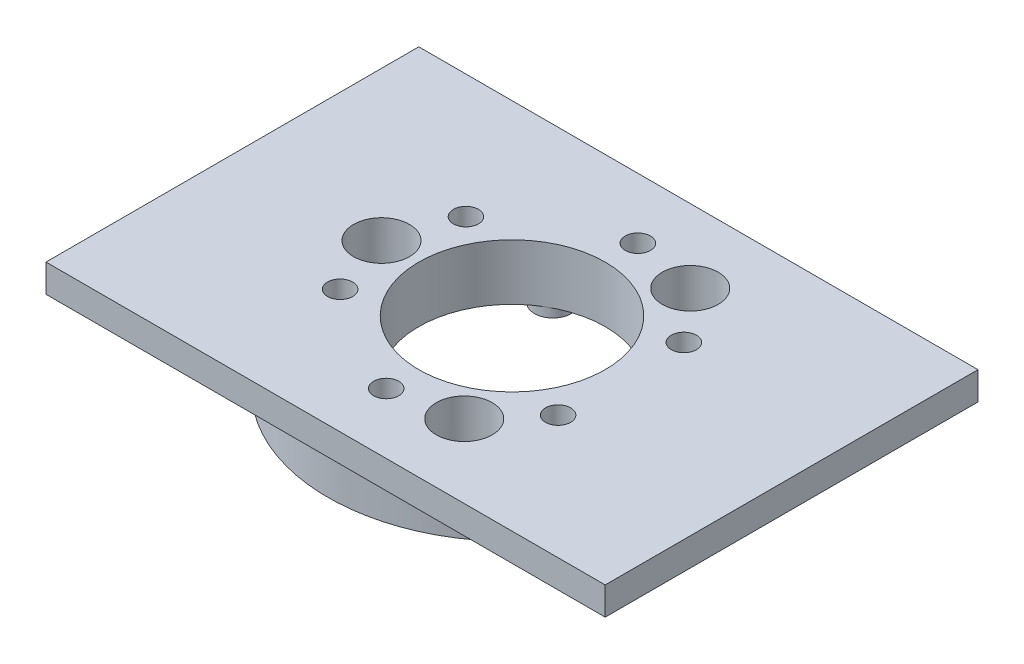
ISO-10303-21;
HEADER;
FILE_DESCRIPTION(('STEP AP214'),'2;1');
FILE_NAME('part.step','',(''),(''),'','','');
FILE_SCHEMA(('AUTOMOTIVE_DESIGN { 1 0 10303 214 1 1 1 1 }'));
ENDSEC;
DATA;
#1=APPLICATION_CONTEXT('core data for automotive mechanical design processes');
#2=APPLICATION_PROTOCOL_DEFINITION('international standard','automotive_design',2000,#1);
#3=PRODUCT_CONTEXT('',#1,'mechanical');
#4=PRODUCT('Part','Part','',(#3));
#5=PRODUCT_RELATED_PRODUCT_CATEGORY('part','',(#4));
#6=PRODUCT_DEFINITION_FORMATION('','',#4);
#7=PRODUCT_DEFINITION_CONTEXT('part definition',#1,'design');
#8=PRODUCT_DEFINITION('design','',#6,#7);
#9=PRODUCT_DEFINITION_SHAPE('','',#8);
#10=(LENGTH_UNIT() NAMED_UNIT(*) SI_UNIT(.MILLI.,.METRE.));
#11=(NAMED_UNIT(*) PLANE_ANGLE_UNIT() SI_UNIT($,.RADIAN.));
#12=(NAMED_UNIT(*) SI_UNIT($,.STERADIAN.) SOLID_ANGLE_UNIT());
#13=UNCERTAINTY_MEASURE_WITH_UNIT(LENGTH_MEASURE(1.E-05),#10,'distance_accuracy_value','');
#14=(GEOMETRIC_REPRESENTATION_CONTEXT(3) GLOBAL_UNCERTAINTY_ASSIGNED_CONTEXT((#13)) GLOBAL_UNIT_ASSIGNED_CONTEXT((#10,
#11,#12)) REPRESENTATION_CONTEXT('',''));
#15=CARTESIAN_POINT('',(0.,0.,0.));
#16=DIRECTION('',(0.,0.,1.));
#17=DIRECTION('',(1.,0.,0.));
#18=AXIS2_PLACEMENT_3D('',#15,#16,#17);
#19=CARTESIAN_POINT('',(0.,1.,0.));
#20=DIRECTION('',(0.,1.,0.));
#21=DIRECTION('',(0.,0.,1.));
#22=AXIS2_PLACEMENT_3D('',#19,#20,#21);
#23=PLANE('',#22);
#24=CARTESIAN_POINT('',(-14.,1.,0.));
#25=DIRECTION('',(0.,-1.,0.));
#26=DIRECTION('',(0.,0.,-1.));
#27=AXIS2_PLACEMENT_3D('',#24,#25,#26);
#28=CIRCLE('',#27,3.);
#29=CARTESIAN_POINT('',(-14.,1.,-3.));
#30=VERTEX_POINT('',#29);
#31=EDGE_CURVE('E139',#30,#30,#28,.T.);
#32=ORIENTED_EDGE('',*,*,#31,.F.);
#33=EDGE_LOOP('',(#32));
#34=FACE_BOUND('',#33,.T.);
#35=CARTESIAN_POINT('',(7.,1.,12.1243556529821));
#36=DIRECTION('',(0.,-1.,0.));
#37=DIRECTION('',(0.,0.,-1.));
#38=AXIS2_PLACEMENT_3D('',#35,#36,#37);
#39=CIRCLE('',#38,3.);
#40=CARTESIAN_POINT('',(7.,1.,9.12435565298214));
#41=VERTEX_POINT('',#40);
#42=EDGE_CURVE('E145',#41,#41,#39,.T.);
#43=ORIENTED_EDGE('',*,*,#42,.F.);
#44=EDGE_LOOP('',(#43));
#45=FACE_BOUND('',#44,.T.);
#46=CARTESIAN_POINT('',(7.,1.,-12.1243556529821));
#47=DIRECTION('',(0.,-1.,0.));
#48=DIRECTION('',(0.,0.,-1.));
#49=AXIS2_PLACEMENT_3D('',#46,#47,#48);
#50=CIRCLE('',#49,2.99999999999999);
#51=CARTESIAN_POINT('',(7.,1.,-15.1243556529821));
#52=VERTEX_POINT('',#51);
#53=EDGE_CURVE('E137',#52,#52,#50,.T.);
#54=ORIENTED_EDGE('',*,*,#53,.F.);
#55=EDGE_LOOP('',(#54));
#56=FACE_BOUND('',#55,.T.);
#57=CARTESIAN_POINT('',(12.,1.,0.));
#58=DIRECTION('',(0.,1.,0.));
#59=DIRECTION('',(0.,0.,1.));
#60=AXIS2_PLACEMENT_3D('',#57,#58,#59);
#61=CIRCLE('',#60,1.98);
#62=CARTESIAN_POINT('',(12.,1.,1.98));
#63=VERTEX_POINT('',#62);
#64=EDGE_CURVE('E250',#63,#63,#61,.F.);
#65=ORIENTED_EDGE('',*,*,#64,.F.);
#66=EDGE_LOOP('',(#65));
#67=FACE_BOUND('',#66,.T.);
#68=CARTESIAN_POINT('',(-6.,1.,-10.3923048454133));
#69=DIRECTION('',(0.,1.,0.));
#70=DIRECTION('',(0.,0.,1.));
#71=AXIS2_PLACEMENT_3D('',#68,#69,#70);
#72=CIRCLE('',#71,1.98);
#73=CARTESIAN_POINT('',(-6.,1.,-8.41230484541327));
#74=VERTEX_POINT('',#73);
#75=EDGE_CURVE('E244',#74,#74,#72,.F.);
#76=ORIENTED_EDGE('',*,*,#75,.F.);
#77=EDGE_LOOP('',(#76));
#78=FACE_BOUND('',#77,.T.);
#79=CARTESIAN_POINT('',(-6.,1.,10.3923048454133));
#80=DIRECTION('',(0.,1.,0.));
#81=DIRECTION('',(0.,0.,1.));
#82=AXIS2_PLACEMENT_3D('',#79,#80,#81);
#83=CIRCLE('',#82,1.98);
#84=CARTESIAN_POINT('',(-6.,1.,12.3723048454133));
#85=VERTEX_POINT('',#84);
#86=EDGE_CURVE('E245',#85,#85,#83,.F.);
#87=ORIENTED_EDGE('',*,*,#86,.F.);
#88=EDGE_LOOP('',(#87));
#89=FACE_BOUND('',#88,.T.);
#90=CARTESIAN_POINT('',(0.,1.,13.5));
#91=DIRECTION('',(0.,-1.,0.));
#92=DIRECTION('',(0.,0.,-1.));
#93=AXIS2_PLACEMENT_3D('',#90,#91,#92);
#94=CIRCLE('',#93,1.35);
#95=CARTESIAN_POINT('',(0.,1.,12.15));
#96=VERTEX_POINT('',#95);
#97=EDGE_CURVE('E200',#96,#96,#94,.T.);
#98=ORIENTED_EDGE('',*,*,#97,.F.);
#99=EDGE_LOOP('',(#98));
#100=FACE_BOUND('',#99,.T.);
#101=CARTESIAN_POINT('',(0.,1.,-13.5));
#102=DIRECTION('',(0.,-1.,0.));
#103=DIRECTION('',(0.,0.,-1.));
#104=AXIS2_PLACEMENT_3D('',#101,#102,#103);
#105=CIRCLE('',#104,1.35);
#106=CARTESIAN_POINT('',(0.,1.,-14.85));
#107=VERTEX_POINT('',#106);
#108=EDGE_CURVE('E209',#107,#107,#105,.T.);
#109=ORIENTED_EDGE('',*,*,#108,.F.);
#110=EDGE_LOOP('',(#109));
#111=FACE_BOUND('',#110,.T.);
#112=CARTESIAN_POINT('',(11.6913429510899,1.,-6.75));
#113=DIRECTION('',(0.,-1.,0.));
#114=DIRECTION('',(0.,0.,-1.));
#115=AXIS2_PLACEMENT_3D('',#112,#113,#114);
#116=CIRCLE('',#115,1.35);
#117=CARTESIAN_POINT('',(11.6913429510899,1.,-8.1));
#118=VERTEX_POINT('',#117);
#119=EDGE_CURVE('E201',#118,#118,#116,.T.);
#120=ORIENTED_EDGE('',*,*,#119,.F.);
#121=EDGE_LOOP('',(#120));
#122=FACE_BOUND('',#121,.T.);
#123=CARTESIAN_POINT('',(11.6913429510899,1.,6.75));
#124=DIRECTION('',(0.,-1.,0.));
#125=DIRECTION('',(0.,0.,-1.));
#126=AXIS2_PLACEMENT_3D('',#123,#124,#125);
#127=CIRCLE('',#126,1.35);
#128=CARTESIAN_POINT('',(11.6913429510899,1.,5.4));
#129=VERTEX_POINT('',#128);
#130=EDGE_CURVE('E219',#129,#129,#127,.T.);
#131=ORIENTED_EDGE('',*,*,#130,.F.);
#132=EDGE_LOOP('',(#131));
#133=FACE_BOUND('',#132,.T.);
#134=CARTESIAN_POINT('',(-11.6913429510899,1.,-6.75000000000001));
#135=DIRECTION('',(0.,-1.,0.));
#136=DIRECTION('',(0.,0.,-1.));
#137=AXIS2_PLACEMENT_3D('',#134,#135,#136);
#138=CIRCLE('',#137,1.35);
#139=CARTESIAN_POINT('',(-11.6913429510899,1.,-8.10000000000001));
#140=VERTEX_POINT('',#139);
#141=EDGE_CURVE('E211',#140,#140,#138,.T.);
#142=ORIENTED_EDGE('',*,*,#141,.F.);
#143=EDGE_LOOP('',(#142));
#144=FACE_BOUND('',#143,.T.);
#145=CARTESIAN_POINT('',(-11.6913429510899,1.,6.75));
#146=DIRECTION('',(0.,-1.,0.));
#147=DIRECTION('',(0.,0.,-1.));
#148=AXIS2_PLACEMENT_3D('',#145,#146,#147);
#149=CIRCLE('',#148,1.35);
#150=CARTESIAN_POINT('',(-11.6913429510899,1.,5.4));
#151=VERTEX_POINT('',#150);
#152=EDGE_CURVE('E229',#151,#151,#149,.T.);
#153=ORIENTED_EDGE('',*,*,#152,.F.);
#154=EDGE_LOOP('',(#153));
#155=FACE_BOUND('',#154,.T.);
#156=CARTESIAN_POINT('',(0.,1.,0.));
#157=DIRECTION('',(0.,1.,0.));
#158=DIRECTION('',(0.,0.,1.));
#159=AXIS2_PLACEMENT_3D('',#156,#157,#158);
#160=CIRCLE('',#159,18.77);
#161=CARTESIAN_POINT('',(0.,1.,18.77));
#162=VERTEX_POINT('',#161);
#163=EDGE_CURVE('E196',#162,#162,#160,.T.);
#164=ORIENTED_EDGE('',*,*,#163,.F.);
#165=EDGE_LOOP('',(#164));
#166=FACE_BOUND('',#165,.T.);
#167=CARTESIAN_POINT('',(0.,1.,0.));
#168=DIRECTION('',(0.,-1.,0.));
#169=DIRECTION('',(0.,0.,-1.));
#170=AXIS2_PLACEMENT_3D('',#167,#168,#169);
#171=CIRCLE('',#170,10.);
#172=CARTESIAN_POINT('',(0.,1.,-10.));
#173=VERTEX_POINT('',#172);
#174=EDGE_CURVE('E199',#173,#173,#171,.T.);
#175=ORIENTED_EDGE('',*,*,#174,.F.);
#176=EDGE_LOOP('',(#175));
#177=FACE_BOUND('',#176,.T.);
#178=ADVANCED_FACE('F43',(#34,#45,#56,#67,#78,#89,#100,#111,#122,#133,#144,#155,#166,#177),#23,.F.);
#179=CARTESIAN_POINT('',(0.,0.,0.));
#180=DIRECTION('',(0.,1.,0.));
#181=DIRECTION('',(0.,0.,1.));
#182=AXIS2_PLACEMENT_3D('',#179,#180,#181);
#183=PLANE('',#182);
#184=CARTESIAN_POINT('',(0.,0.,0.));
#185=DIRECTION('',(0.,1.,0.));
#186=DIRECTION('',(0.,0.,1.));
#187=AXIS2_PLACEMENT_3D('',#184,#185,#186);
#188=CIRCLE('',#187,19.75);
#189=CARTESIAN_POINT('',(-5.63424270988335,0.,-18.9292844314339));
#190=VERTEX_POINT('',#189);
#191=CARTESIAN_POINT('',(5.63424270988335,0.,-18.9292844314339));
#192=VERTEX_POINT('',#191);
#193=EDGE_CURVE('E238',#190,#192,#188,.T.);
#194=ORIENTED_EDGE('',*,*,#193,.F.);
#195=DIRECTION('',(0.285278111892828,0.,0.958444781338426));
#196=VECTOR('',#195,1.);
#197=CARTESIAN_POINT('',(-5.51890637124537,0.,-18.5417905885562));
#198=LINE('',#197,#196);
#199=CARTESIAN_POINT('',(-5.99084034974938,0.,-20.1273404081069));
#200=VERTEX_POINT('',#199);
#201=EDGE_CURVE('E111',#200,#190,#198,.T.);
#202=ORIENTED_EDGE('',*,*,#201,.F.);
#203=CARTESIAN_POINT('',(0.,0.,0.));
#204=DIRECTION('',(0.,1.,0.));
#205=DIRECTION('',(0.,0.,1.));
#206=AXIS2_PLACEMENT_3D('',#203,#204,#205);
#207=CIRCLE('',#206,21.);
#208=CARTESIAN_POINT('',(5.99084034974938,0.,-20.1273404081069));
#209=VERTEX_POINT('',#208);
#210=EDGE_CURVE('E115',#209,#200,#207,.T.);
#211=ORIENTED_EDGE('',*,*,#210,.F.);
#212=DIRECTION('',(0.285278111892828,0.,-0.958444781338426));
#213=VECTOR('',#212,1.);
#214=CARTESIAN_POINT('',(5.51890637124537,0.,-18.5417905885562));
#215=LINE('',#214,#213);
#216=EDGE_CURVE('E102',#192,#209,#215,.T.);
#217=ORIENTED_EDGE('',*,*,#216,.F.);
#218=EDGE_LOOP('',(#194,#202,#211,#217));
#219=FACE_BOUND('',#218,.T.);
#220=CARTESIAN_POINT('',(0.,0.,0.));
#221=DIRECTION('',(0.,1.,0.));
#222=DIRECTION('',(0.,0.,1.));
#223=AXIS2_PLACEMENT_3D('',#220,#221,#222);
#224=CIRCLE('',#223,18.77);
#225=CARTESIAN_POINT('',(0.,0.,18.77));
#226=VERTEX_POINT('',#225);
#227=EDGE_CURVE('E240',#226,#226,#224,.T.);
#228=ORIENTED_EDGE('',*,*,#227,.T.);
#229=EDGE_LOOP('',(#228));
#230=FACE_BOUND('',#229,.T.);
#231=ADVANCED_FACE('F126',(#219,#230),#183,.F.);
#232=CARTESIAN_POINT('',(0.,1.,0.));
#233=DIRECTION('',(0.,-1.,0.));
#234=DIRECTION('',(0.,0.,-1.));
#235=AXIS2_PLACEMENT_3D('',#232,#233,#234);
#236=CYLINDRICAL_SURFACE('',#235,19.75);
#237=CARTESIAN_POINT('',(0.,4.,0.));
#238=DIRECTION('',(0.,1.,0.));
#239=DIRECTION('',(0.,0.,1.));
#240=AXIS2_PLACEMENT_3D('',#237,#238,#239);
#241=CIRCLE('',#240,19.75);
#242=CARTESIAN_POINT('',(0.,4.,19.75));
#243=VERTEX_POINT('',#242);
#244=EDGE_CURVE('E149',#243,#243,#241,.T.);
#245=ORIENTED_EDGE('',*,*,#244,.F.);
#246=EDGE_LOOP('',(#245));
#247=FACE_BOUND('',#246,.T.);
#248=CARTESIAN_POINT('',(0.,3.,0.));
#249=DIRECTION('',(0.,-1.,0.));
#250=DIRECTION('',(0.,0.,-1.));
#251=AXIS2_PLACEMENT_3D('',#248,#249,#250);
#252=CIRCLE('',#251,19.75);
#253=CARTESIAN_POINT('',(-5.63424270988335,3.,-18.9292844314339));
#254=VERTEX_POINT('',#253);
#255=CARTESIAN_POINT('',(5.63424270988335,3.,-18.9292844314339));
#256=VERTEX_POINT('',#255);
#257=EDGE_CURVE('E60',#254,#256,#252,.T.);
#258=ORIENTED_EDGE('',*,*,#257,.F.);
#259=DIRECTION('',(0.,-1.,0.));
#260=VECTOR('',#259,1.);
#261=CARTESIAN_POINT('',(-5.63424270988335,1.,-18.9292844314339));
#262=LINE('',#261,#260);
#263=EDGE_CURVE('E11',#254,#190,#262,.T.);
#264=ORIENTED_EDGE('',*,*,#263,.T.);
#265=ORIENTED_EDGE('',*,*,#193,.T.);
#266=DIRECTION('',(0.,-1.,0.));
#267=VECTOR('',#266,1.);
#268=CARTESIAN_POINT('',(5.63424270988335,1.,-18.9292844314339));
#269=LINE('',#268,#267);
#270=EDGE_CURVE('E51',#192,#256,#269,.F.);
#271=ORIENTED_EDGE('',*,*,#270,.T.);
#272=EDGE_LOOP('',(#258,#264,#265,#271));
#273=FACE_BOUND('',#272,.T.);
#274=ADVANCED_FACE('F44',(#247,#273),#236,.T.);
#275=CARTESIAN_POINT('',(0.,1.,0.));
#276=DIRECTION('',(0.,-1.,0.));
#277=DIRECTION('',(0.,0.,-1.));
#278=AXIS2_PLACEMENT_3D('',#275,#276,#277);
#279=CYLINDRICAL_SURFACE('',#278,18.77);
#280=ORIENTED_EDGE('',*,*,#163,.T.);
#281=EDGE_LOOP('',(#280));
#282=FACE_BOUND('',#281,.T.);
#283=ORIENTED_EDGE('',*,*,#227,.F.);
#284=EDGE_LOOP('',(#283));
#285=FACE_BOUND('',#284,.T.);
#286=ADVANCED_FACE('F288',(#282,#285),#279,.F.);
#287=CARTESIAN_POINT('',(0.,7.,0.));
#288=DIRECTION('',(0.,1.,0.));
#289=DIRECTION('',(0.,0.,1.));
#290=AXIS2_PLACEMENT_3D('',#287,#288,#289);
#291=PLANE('',#290);
#292=CARTESIAN_POINT('',(-14.,7.,0.));
#293=DIRECTION('',(0.,1.,0.));
#294=DIRECTION('',(0.,0.,1.));
#295=AXIS2_PLACEMENT_3D('',#292,#293,#294);
#296=CIRCLE('',#295,3.);
#297=CARTESIAN_POINT('',(-14.,7.,3.));
#298=VERTEX_POINT('',#297);
#299=EDGE_CURVE('E153',#298,#298,#296,.T.);
#300=ORIENTED_EDGE('',*,*,#299,.F.);
#301=EDGE_LOOP('',(#300));
#302=FACE_BOUND('',#301,.T.);
#303=CARTESIAN_POINT('',(7.,7.,12.1243556529821));
#304=DIRECTION('',(0.,1.,0.));
#305=DIRECTION('',(0.,0.,1.));
#306=AXIS2_PLACEMENT_3D('',#303,#304,#305);
#307=CIRCLE('',#306,3.);
#308=CARTESIAN_POINT('',(7.,7.,15.1243556529821));
#309=VERTEX_POINT('',#308);
#310=EDGE_CURVE('E251',#309,#309,#307,.T.);
#311=ORIENTED_EDGE('',*,*,#310,.F.);
#312=EDGE_LOOP('',(#311));
#313=FACE_BOUND('',#312,.T.);
#314=CARTESIAN_POINT('',(7.,7.,-12.1243556529821));
#315=DIRECTION('',(0.,1.,0.));
#316=DIRECTION('',(0.,0.,1.));
#317=AXIS2_PLACEMENT_3D('',#314,#315,#316);
#318=CIRCLE('',#317,2.99999999999999);
#319=CARTESIAN_POINT('',(7.,7.,-9.12435565298215));
#320=VERTEX_POINT('',#319);
#321=EDGE_CURVE('E141',#320,#320,#318,.T.);
#322=ORIENTED_EDGE('',*,*,#321,.F.);
#323=EDGE_LOOP('',(#322));
#324=FACE_BOUND('',#323,.T.);
#325=CARTESIAN_POINT('',(0.,7.,13.5));
#326=DIRECTION('',(0.,-1.,0.));
#327=DIRECTION('',(0.,0.,-1.));
#328=AXIS2_PLACEMENT_3D('',#325,#326,#327);
#329=CIRCLE('',#328,1.35);
#330=CARTESIAN_POINT('',(0.,7.,12.15));
#331=VERTEX_POINT('',#330);
#332=EDGE_CURVE('E193',#331,#331,#329,.T.);
#333=ORIENTED_EDGE('',*,*,#332,.T.);
#334=EDGE_LOOP('',(#333));
#335=FACE_BOUND('',#334,.T.);
#336=CARTESIAN_POINT('',(0.,7.,-13.5));
#337=DIRECTION('',(0.,-1.,0.));
#338=DIRECTION('',(0.,0.,-1.));
#339=AXIS2_PLACEMENT_3D('',#336,#337,#338);
#340=CIRCLE('',#339,1.35);
#341=CARTESIAN_POINT('',(0.,7.,-14.85));
#342=VERTEX_POINT('',#341);
#343=EDGE_CURVE('E212',#342,#342,#340,.T.);
#344=ORIENTED_EDGE('',*,*,#343,.T.);
#345=EDGE_LOOP('',(#344));
#346=FACE_BOUND('',#345,.T.);
#347=CARTESIAN_POINT('',(11.6913429510899,7.,-6.75));
#348=DIRECTION('',(0.,-1.,0.));
#349=DIRECTION('',(0.,0.,-1.));
#350=AXIS2_PLACEMENT_3D('',#347,#348,#349);
#351=CIRCLE('',#350,1.35);
#352=CARTESIAN_POINT('',(11.6913429510899,7.,-8.1));
#353=VERTEX_POINT('',#352);
#354=EDGE_CURVE('E204',#353,#353,#351,.T.);
#355=ORIENTED_EDGE('',*,*,#354,.T.);
#356=EDGE_LOOP('',(#355));
#357=FACE_BOUND('',#356,.T.);
#358=CARTESIAN_POINT('',(11.6913429510899,7.,6.75));
#359=DIRECTION('',(0.,-1.,0.));
#360=DIRECTION('',(0.,0.,-1.));
#361=AXIS2_PLACEMENT_3D('',#358,#359,#360);
#362=CIRCLE('',#361,1.35);
#363=CARTESIAN_POINT('',(11.6913429510899,7.,5.4));
#364=VERTEX_POINT('',#363);
#365=EDGE_CURVE('E203',#364,#364,#362,.T.);
#366=ORIENTED_EDGE('',*,*,#365,.T.);
#367=EDGE_LOOP('',(#366));
#368=FACE_BOUND('',#367,.T.);
#369=CARTESIAN_POINT('',(0.,7.,0.));
#370=DIRECTION('',(0.,-1.,0.));
#371=DIRECTION('',(0.,0.,-1.));
#372=AXIS2_PLACEMENT_3D('',#369,#370,#371);
#373=CIRCLE('',#372,10.);
#374=CARTESIAN_POINT('',(0.,7.,-10.));
#375=VERTEX_POINT('',#374);
#376=EDGE_CURVE('E220',#375,#375,#373,.T.);
#377=ORIENTED_EDGE('',*,*,#376,.T.);
#378=EDGE_LOOP('',(#377));
#379=FACE_BOUND('',#378,.T.);
#380=CARTESIAN_POINT('',(-11.6913429510899,7.,-6.75000000000001));
#381=DIRECTION('',(0.,-1.,0.));
#382=DIRECTION('',(0.,0.,-1.));
#383=AXIS2_PLACEMENT_3D('',#380,#381,#382);
#384=CIRCLE('',#383,1.35);
#385=CARTESIAN_POINT('',(-11.6913429510899,7.,-8.10000000000001));
#386=VERTEX_POINT('',#385);
#387=EDGE_CURVE('E230',#386,#386,#384,.T.);
#388=ORIENTED_EDGE('',*,*,#387,.T.);
#389=EDGE_LOOP('',(#388));
#390=FACE_BOUND('',#389,.T.);
#391=CARTESIAN_POINT('',(-11.6913429510899,7.,6.75));
#392=DIRECTION('',(0.,-1.,0.));
#393=DIRECTION('',(0.,0.,-1.));
#394=AXIS2_PLACEMENT_3D('',#391,#392,#393);
#395=CIRCLE('',#394,1.35);
#396=CARTESIAN_POINT('',(-11.6913429510899,7.,5.4));
#397=VERTEX_POINT('',#396);
#398=EDGE_CURVE('E190',#397,#397,#395,.T.);
#399=ORIENTED_EDGE('',*,*,#398,.T.);
#400=EDGE_LOOP('',(#399));
#401=FACE_BOUND('',#400,.T.);
#402=DIRECTION('',(0.,0.,-1.));
#403=VECTOR('',#402,1.);
#404=CARTESIAN_POINT('',(30.,7.,20.));
#405=LINE('',#404,#403);
#406=CARTESIAN_POINT('',(30.,7.,20.));
#407=VERTEX_POINT('',#406);
#408=CARTESIAN_POINT('',(30.,7.,-20.));
#409=VERTEX_POINT('',#408);
#410=EDGE_CURVE('E148',#407,#409,#405,.T.);
#411=ORIENTED_EDGE('',*,*,#410,.T.);
#412=DIRECTION('',(-1.,0.,0.));
#413=VECTOR('',#412,1.);
#414=CARTESIAN_POINT('',(-30.,7.,-20.));
#415=LINE('',#414,#413);
#416=CARTESIAN_POINT('',(-30.,7.,-20.));
#417=VERTEX_POINT('',#416);
#418=EDGE_CURVE('E168',#409,#417,#415,.T.);
#419=ORIENTED_EDGE('',*,*,#418,.T.);
#420=DIRECTION('',(0.,0.,1.));
#421=VECTOR('',#420,1.);
#422=CARTESIAN_POINT('',(-30.,7.,20.));
#423=LINE('',#422,#421);
#424=CARTESIAN_POINT('',(-30.,7.,20.));
#425=VERTEX_POINT('',#424);
#426=EDGE_CURVE('E172',#417,#425,#423,.T.);
#427=ORIENTED_EDGE('',*,*,#426,.T.);
#428=DIRECTION('',(1.,0.,0.));
#429=VECTOR('',#428,1.);
#430=CARTESIAN_POINT('',(-30.,7.,20.));
#431=LINE('',#430,#429);
#432=EDGE_CURVE('E157',#425,#407,#431,.T.);
#433=ORIENTED_EDGE('',*,*,#432,.T.);
#434=EDGE_LOOP('',(#411,#419,#427,#433));
#435=FACE_BOUND('',#434,.T.);
#436=ADVANCED_FACE('F289',(#302,#313,#324,#335,#346,#357,#368,#379,#390,#401,#435),#291,.T.);
#437=CARTESIAN_POINT('',(-11.6913429510899,7.,6.75));
#438=DIRECTION('',(0.,-1.,0.));
#439=DIRECTION('',(0.,0.,-1.));
#440=AXIS2_PLACEMENT_3D('',#437,#438,#439);
#441=CYLINDRICAL_SURFACE('',#440,1.35);
#442=ORIENTED_EDGE('',*,*,#398,.F.);
#443=EDGE_LOOP('',(#442));
#444=FACE_BOUND('',#443,.T.);
#445=ORIENTED_EDGE('',*,*,#152,.T.);
#446=EDGE_LOOP('',(#445));
#447=FACE_BOUND('',#446,.T.);
#448=ADVANCED_FACE('F297',(#444,#447),#441,.F.);
#449=CARTESIAN_POINT('',(-11.6913429510899,7.,-6.75000000000001));
#450=DIRECTION('',(0.,-1.,0.));
#451=DIRECTION('',(0.,0.,-1.));
#452=AXIS2_PLACEMENT_3D('',#449,#450,#451);
#453=CYLINDRICAL_SURFACE('',#452,1.35);
#454=ORIENTED_EDGE('',*,*,#387,.F.);
#455=EDGE_LOOP('',(#454));
#456=FACE_BOUND('',#455,.T.);
#457=ORIENTED_EDGE('',*,*,#141,.T.);
#458=EDGE_LOOP('',(#457));
#459=FACE_BOUND('',#458,.T.);
#460=ADVANCED_FACE('F309',(#456,#459),#453,.F.);
#461=CARTESIAN_POINT('',(0.,7.,0.));
#462=DIRECTION('',(0.,-1.,0.));
#463=DIRECTION('',(0.,0.,-1.));
#464=AXIS2_PLACEMENT_3D('',#461,#462,#463);
#465=CYLINDRICAL_SURFACE('',#464,10.);
#466=ORIENTED_EDGE('',*,*,#376,.F.);
#467=EDGE_LOOP('',(#466));
#468=FACE_BOUND('',#467,.T.);
#469=ORIENTED_EDGE('',*,*,#174,.T.);
#470=EDGE_LOOP('',(#469));
#471=FACE_BOUND('',#470,.T.);
#472=ADVANCED_FACE('F307',(#468,#471),#465,.F.);
#473=CARTESIAN_POINT('',(11.6913429510899,7.,6.75));
#474=DIRECTION('',(0.,-1.,0.));
#475=DIRECTION('',(0.,0.,-1.));
#476=AXIS2_PLACEMENT_3D('',#473,#474,#475);
#477=CYLINDRICAL_SURFACE('',#476,1.35);
#478=ORIENTED_EDGE('',*,*,#365,.F.);
#479=EDGE_LOOP('',(#478));
#480=FACE_BOUND('',#479,.T.);
#481=ORIENTED_EDGE('',*,*,#130,.T.);
#482=EDGE_LOOP('',(#481));
#483=FACE_BOUND('',#482,.T.);
#484=ADVANCED_FACE('F306',(#480,#483),#477,.F.);
#485=CARTESIAN_POINT('',(11.6913429510899,7.,-6.75));
#486=DIRECTION('',(0.,-1.,0.));
#487=DIRECTION('',(0.,0.,-1.));
#488=AXIS2_PLACEMENT_3D('',#485,#486,#487);
#489=CYLINDRICAL_SURFACE('',#488,1.35);
#490=ORIENTED_EDGE('',*,*,#354,.F.);
#491=EDGE_LOOP('',(#490));
#492=FACE_BOUND('',#491,.T.);
#493=ORIENTED_EDGE('',*,*,#119,.T.);
#494=EDGE_LOOP('',(#493));
#495=FACE_BOUND('',#494,.T.);
#496=ADVANCED_FACE('F316',(#492,#495),#489,.F.);
#497=CARTESIAN_POINT('',(0.,7.,-13.5));
#498=DIRECTION('',(0.,-1.,0.));
#499=DIRECTION('',(0.,0.,-1.));
#500=AXIS2_PLACEMENT_3D('',#497,#498,#499);
#501=CYLINDRICAL_SURFACE('',#500,1.35);
#502=ORIENTED_EDGE('',*,*,#343,.F.);
#503=EDGE_LOOP('',(#502));
#504=FACE_BOUND('',#503,.T.);
#505=ORIENTED_EDGE('',*,*,#108,.T.);
#506=EDGE_LOOP('',(#505));
#507=FACE_BOUND('',#506,.T.);
#508=ADVANCED_FACE('F325',(#504,#507),#501,.F.);
#509=CARTESIAN_POINT('',(0.,7.,13.5));
#510=DIRECTION('',(0.,-1.,0.));
#511=DIRECTION('',(0.,0.,-1.));
#512=AXIS2_PLACEMENT_3D('',#509,#510,#511);
#513=CYLINDRICAL_SURFACE('',#512,1.35);
#514=ORIENTED_EDGE('',*,*,#332,.F.);
#515=EDGE_LOOP('',(#514));
#516=FACE_BOUND('',#515,.T.);
#517=ORIENTED_EDGE('',*,*,#97,.T.);
#518=EDGE_LOOP('',(#517));
#519=FACE_BOUND('',#518,.T.);
#520=ADVANCED_FACE('F393',(#516,#519),#513,.F.);
#521=CARTESIAN_POINT('',(-6.,0.,10.3923048454133));
#522=DIRECTION('',(0.,1.,0.));
#523=DIRECTION('',(0.,0.,1.));
#524=AXIS2_PLACEMENT_3D('',#521,#522,#523);
#525=CYLINDRICAL_SURFACE('',#524,1.98);
#526=CARTESIAN_POINT('',(-6.,0.,10.3923048454133));
#527=DIRECTION('',(0.,-1.,0.));
#528=DIRECTION('',(0.,0.,-1.));
#529=AXIS2_PLACEMENT_3D('',#526,#527,#528);
#530=CIRCLE('',#529,1.98);
#531=CARTESIAN_POINT('',(-6.,0.,8.41230484541327));
#532=VERTEX_POINT('',#531);
#533=EDGE_CURVE('E176',#532,#532,#530,.T.);
#534=ORIENTED_EDGE('',*,*,#533,.F.);
#535=EDGE_LOOP('',(#534));
#536=FACE_BOUND('',#535,.T.);
#537=ORIENTED_EDGE('',*,*,#86,.T.);
#538=EDGE_LOOP('',(#537));
#539=FACE_BOUND('',#538,.T.);
#540=ADVANCED_FACE('F386',(#536,#539),#525,.T.);
#541=CARTESIAN_POINT('',(-6.,0.,10.3923048454133));
#542=DIRECTION('',(0.,-1.,0.));
#543=DIRECTION('',(0.,0.,-1.));
#544=AXIS2_PLACEMENT_3D('',#541,#542,#543);
#545=PLANE('',#544);
#546=ORIENTED_EDGE('',*,*,#533,.T.);
#547=EDGE_LOOP('',(#546));
#548=FACE_BOUND('',#547,.T.);
#549=ADVANCED_FACE('F383',(#548),#545,.T.);
#550=CARTESIAN_POINT('',(-6.,0.,-10.3923048454133));
#551=DIRECTION('',(0.,1.,0.));
#552=DIRECTION('',(0.,0.,1.));
#553=AXIS2_PLACEMENT_3D('',#550,#551,#552);
#554=CYLINDRICAL_SURFACE('',#553,1.98);
#555=CARTESIAN_POINT('',(-6.,0.,-10.3923048454133));
#556=DIRECTION('',(0.,-1.,0.));
#557=DIRECTION('',(0.,0.,-1.));
#558=AXIS2_PLACEMENT_3D('',#555,#556,#557);
#559=CIRCLE('',#558,1.98);
#560=CARTESIAN_POINT('',(-6.,0.,-12.3723048454133));
#561=VERTEX_POINT('',#560);
#562=EDGE_CURVE('E186',#561,#561,#559,.T.);
#563=ORIENTED_EDGE('',*,*,#562,.F.);
#564=EDGE_LOOP('',(#563));
#565=FACE_BOUND('',#564,.T.);
#566=ORIENTED_EDGE('',*,*,#75,.T.);
#567=EDGE_LOOP('',(#566));
#568=FACE_BOUND('',#567,.T.);
#569=ADVANCED_FACE('F382',(#565,#568),#554,.T.);
#570=CARTESIAN_POINT('',(-6.,0.,-10.3923048454133));
#571=DIRECTION('',(0.,-1.,0.));
#572=DIRECTION('',(0.,0.,-1.));
#573=AXIS2_PLACEMENT_3D('',#570,#571,#572);
#574=PLANE('',#573);
#575=ORIENTED_EDGE('',*,*,#562,.T.);
#576=EDGE_LOOP('',(#575));
#577=FACE_BOUND('',#576,.T.);
#578=ADVANCED_FACE('F380',(#577),#574,.T.);
#579=CARTESIAN_POINT('',(12.,0.,0.));
#580=DIRECTION('',(0.,1.,0.));
#581=DIRECTION('',(0.,0.,1.));
#582=AXIS2_PLACEMENT_3D('',#579,#580,#581);
#583=CYLINDRICAL_SURFACE('',#582,1.98);
#584=CARTESIAN_POINT('',(12.,0.,0.));
#585=DIRECTION('',(0.,-1.,0.));
#586=DIRECTION('',(0.,0.,-1.));
#587=AXIS2_PLACEMENT_3D('',#584,#585,#586);
#588=CIRCLE('',#587,1.98);
#589=CARTESIAN_POINT('',(12.,0.,-1.98));
#590=VERTEX_POINT('',#589);
#591=EDGE_CURVE('E185',#590,#590,#588,.T.);
#592=ORIENTED_EDGE('',*,*,#591,.F.);
#593=EDGE_LOOP('',(#592));
#594=FACE_BOUND('',#593,.T.);
#595=ORIENTED_EDGE('',*,*,#64,.T.);
#596=EDGE_LOOP('',(#595));
#597=FACE_BOUND('',#596,.T.);
#598=ADVANCED_FACE('F375',(#594,#597),#583,.T.);
#599=CARTESIAN_POINT('',(12.,0.,0.));
#600=DIRECTION('',(0.,-1.,0.));
#601=DIRECTION('',(0.,0.,-1.));
#602=AXIS2_PLACEMENT_3D('',#599,#600,#601);
#603=PLANE('',#602);
#604=ORIENTED_EDGE('',*,*,#591,.T.);
#605=EDGE_LOOP('',(#604));
#606=FACE_BOUND('',#605,.T.);
#607=ADVANCED_FACE('F369',(#606),#603,.T.);
#608=CARTESIAN_POINT('',(30.,4.,20.));
#609=DIRECTION('',(1.,0.,0.));
#610=DIRECTION('',(0.,0.,-1.));
#611=AXIS2_PLACEMENT_3D('',#608,#609,#610);
#612=PLANE('',#611);
#613=ORIENTED_EDGE('',*,*,#410,.F.);
#614=DIRECTION('',(0.,1.,0.));
#615=VECTOR('',#614,1.);
#616=CARTESIAN_POINT('',(30.,4.,20.));
#617=LINE('',#616,#615);
#618=CARTESIAN_POINT('',(30.,4.,20.));
#619=VERTEX_POINT('',#618);
#620=EDGE_CURVE('E178',#619,#407,#617,.T.);
#621=ORIENTED_EDGE('',*,*,#620,.F.);
#622=DIRECTION('',(0.,0.,-1.));
#623=VECTOR('',#622,1.);
#624=CARTESIAN_POINT('',(30.,4.,20.));
#625=LINE('',#624,#623);
#626=CARTESIAN_POINT('',(30.,4.,-20.));
#627=VERTEX_POINT('',#626);
#628=EDGE_CURVE('E155',#619,#627,#625,.T.);
#629=ORIENTED_EDGE('',*,*,#628,.T.);
#630=DIRECTION('',(0.,1.,0.));
#631=VECTOR('',#630,1.);
#632=CARTESIAN_POINT('',(30.,4.,-20.));
#633=LINE('',#632,#631);
#634=EDGE_CURVE('E163',#627,#409,#633,.T.);
#635=ORIENTED_EDGE('',*,*,#634,.T.);
#636=EDGE_LOOP('',(#613,#621,#629,#635));
#637=FACE_BOUND('',#636,.T.);
#638=ADVANCED_FACE('F336',(#637),#612,.T.);
#639=CARTESIAN_POINT('',(-30.,4.,20.));
#640=DIRECTION('',(0.,0.,1.));
#641=DIRECTION('',(1.,0.,0.));
#642=AXIS2_PLACEMENT_3D('',#639,#640,#641);
#643=PLANE('',#642);
#644=ORIENTED_EDGE('',*,*,#432,.F.);
#645=DIRECTION('',(0.,1.,0.));
#646=VECTOR('',#645,1.);
#647=CARTESIAN_POINT('',(-30.,4.,20.));
#648=LINE('',#647,#646);
#649=CARTESIAN_POINT('',(-30.,4.,20.));
#650=VERTEX_POINT('',#649);
#651=EDGE_CURVE('E177',#650,#425,#648,.T.);
#652=ORIENTED_EDGE('',*,*,#651,.F.);
#653=DIRECTION('',(1.,0.,0.));
#654=VECTOR('',#653,1.);
#655=CARTESIAN_POINT('',(-30.,4.,20.));
#656=LINE('',#655,#654);
#657=EDGE_CURVE('E165',#650,#619,#656,.T.);
#658=ORIENTED_EDGE('',*,*,#657,.T.);
#659=ORIENTED_EDGE('',*,*,#620,.T.);
#660=EDGE_LOOP('',(#644,#652,#658,#659));
#661=FACE_BOUND('',#660,.T.);
#662=ADVANCED_FACE('F348',(#661),#643,.T.);
#663=CARTESIAN_POINT('',(-30.,4.,20.));
#664=DIRECTION('',(-1.,0.,0.));
#665=DIRECTION('',(0.,0.,1.));
#666=AXIS2_PLACEMENT_3D('',#663,#664,#665);
#667=PLANE('',#666);
#668=ORIENTED_EDGE('',*,*,#426,.F.);
#669=DIRECTION('',(0.,1.,0.));
#670=VECTOR('',#669,1.);
#671=CARTESIAN_POINT('',(-30.,4.,-20.));
#672=LINE('',#671,#670);
#673=CARTESIAN_POINT('',(-30.,4.,-20.));
#674=VERTEX_POINT('',#673);
#675=EDGE_CURVE('E183',#674,#417,#672,.T.);
#676=ORIENTED_EDGE('',*,*,#675,.F.);
#677=DIRECTION('',(0.,0.,1.));
#678=VECTOR('',#677,1.);
#679=CARTESIAN_POINT('',(-30.,4.,20.));
#680=LINE('',#679,#678);
#681=EDGE_CURVE('E159',#674,#650,#680,.T.);
#682=ORIENTED_EDGE('',*,*,#681,.T.);
#683=ORIENTED_EDGE('',*,*,#651,.T.);
#684=EDGE_LOOP('',(#668,#676,#682,#683));
#685=FACE_BOUND('',#684,.T.);
#686=ADVANCED_FACE('F346',(#685),#667,.T.);
#687=CARTESIAN_POINT('',(-30.,4.,-20.));
#688=DIRECTION('',(0.,0.,-1.));
#689=DIRECTION('',(-1.,0.,0.));
#690=AXIS2_PLACEMENT_3D('',#687,#688,#689);
#691=PLANE('',#690);
#692=ORIENTED_EDGE('',*,*,#418,.F.);
#693=ORIENTED_EDGE('',*,*,#634,.F.);
#694=DIRECTION('',(-1.,0.,0.));
#695=VECTOR('',#694,1.);
#696=CARTESIAN_POINT('',(-30.,4.,-20.));
#697=LINE('',#696,#695);
#698=EDGE_CURVE('E154',#627,#674,#697,.T.);
#699=ORIENTED_EDGE('',*,*,#698,.T.);
#700=ORIENTED_EDGE('',*,*,#675,.T.);
#701=EDGE_LOOP('',(#692,#693,#699,#700));
#702=FACE_BOUND('',#701,.T.);
#703=ADVANCED_FACE('F345',(#702),#691,.T.);
#704=CARTESIAN_POINT('',(0.,4.,0.));
#705=DIRECTION('',(0.,-1.,0.));
#706=DIRECTION('',(0.,0.,-1.));
#707=AXIS2_PLACEMENT_3D('',#704,#705,#706);
#708=PLANE('',#707);
#709=ORIENTED_EDGE('',*,*,#244,.T.);
#710=EDGE_LOOP('',(#709));
#711=FACE_BOUND('',#710,.T.);
#712=ORIENTED_EDGE('',*,*,#628,.F.);
#713=ORIENTED_EDGE('',*,*,#657,.F.);
#714=ORIENTED_EDGE('',*,*,#681,.F.);
#715=ORIENTED_EDGE('',*,*,#698,.F.);
#716=EDGE_LOOP('',(#712,#713,#714,#715));
#717=FACE_BOUND('',#716,.T.);
#718=ADVANCED_FACE('F351',(#711,#717),#708,.T.);
#719=CARTESIAN_POINT('',(7.,21.,-12.1243556529821));
#720=DIRECTION('',(0.,-1.,0.));
#721=DIRECTION('',(0.,0.,-1.));
#722=AXIS2_PLACEMENT_3D('',#719,#720,#721);
#723=CYLINDRICAL_SURFACE('',#722,2.99999999999999);
#724=ORIENTED_EDGE('',*,*,#321,.T.);
#725=EDGE_LOOP('',(#724));
#726=FACE_BOUND('',#725,.T.);
#727=ORIENTED_EDGE('',*,*,#53,.T.);
#728=EDGE_LOOP('',(#727));
#729=FACE_BOUND('',#728,.T.);
#730=ADVANCED_FACE('F355',(#726,#729),#723,.F.);
#731=CARTESIAN_POINT('',(7.,21.,12.1243556529821));
#732=DIRECTION('',(0.,-1.,0.));
#733=DIRECTION('',(0.,0.,-1.));
#734=AXIS2_PLACEMENT_3D('',#731,#732,#733);
#735=CYLINDRICAL_SURFACE('',#734,3.);
#736=ORIENTED_EDGE('',*,*,#310,.T.);
#737=EDGE_LOOP('',(#736));
#738=FACE_BOUND('',#737,.T.);
#739=ORIENTED_EDGE('',*,*,#42,.T.);
#740=EDGE_LOOP('',(#739));
#741=FACE_BOUND('',#740,.T.);
#742=ADVANCED_FACE('F275',(#738,#741),#735,.F.);
#743=CARTESIAN_POINT('',(-14.,21.,0.));
#744=DIRECTION('',(0.,-1.,0.));
#745=DIRECTION('',(0.,0.,-1.));
#746=AXIS2_PLACEMENT_3D('',#743,#744,#745);
#747=CYLINDRICAL_SURFACE('',#746,3.);
#748=ORIENTED_EDGE('',*,*,#299,.T.);
#749=EDGE_LOOP('',(#748));
#750=FACE_BOUND('',#749,.T.);
#751=ORIENTED_EDGE('',*,*,#31,.T.);
#752=EDGE_LOOP('',(#751));
#753=FACE_BOUND('',#752,.T.);
#754=ADVANCED_FACE('F264',(#750,#753),#747,.F.);
#755=CARTESIAN_POINT('',(-5.51890637124537,3.,-18.5417905885562));
#756=DIRECTION('',(-0.958444781338426,0.,0.285278111892828));
#757=DIRECTION('',(0.285278111892828,0.,0.958444781338426));
#758=AXIS2_PLACEMENT_3D('',#755,#756,#757);
#759=PLANE('',#758);
#760=ORIENTED_EDGE('',*,*,#263,.F.);
#761=DIRECTION('',(-0.285278111892828,0.,-0.958444781338426));
#762=VECTOR('',#761,1.);
#763=CARTESIAN_POINT('',(-5.51890637124537,3.,-18.5417905885562));
#764=LINE('',#763,#762);
#765=CARTESIAN_POINT('',(-5.99084034974938,3.,-20.1273404081069));
#766=VERTEX_POINT('',#765);
#767=EDGE_CURVE('E123',#254,#766,#764,.T.);
#768=ORIENTED_EDGE('',*,*,#767,.T.);
#769=DIRECTION('',(0.,-1.,0.));
#770=VECTOR('',#769,1.);
#771=CARTESIAN_POINT('',(-5.99084034974938,3.,-20.1273404081069));
#772=LINE('',#771,#770);
#773=EDGE_CURVE('E125',#766,#200,#772,.T.);
#774=ORIENTED_EDGE('',*,*,#773,.T.);
#775=ORIENTED_EDGE('',*,*,#201,.T.);
#776=EDGE_LOOP('',(#760,#768,#774,#775));
#777=FACE_BOUND('',#776,.T.);
#778=ADVANCED_FACE('F265',(#777),#759,.T.);
#779=CARTESIAN_POINT('',(5.51890637124537,3.,-18.5417905885562));
#780=DIRECTION('',(0.958444781338426,0.,0.285278111892828));
#781=DIRECTION('',(0.285278111892828,0.,-0.958444781338426));
#782=AXIS2_PLACEMENT_3D('',#779,#780,#781);
#783=PLANE('',#782);
#784=ORIENTED_EDGE('',*,*,#270,.F.);
#785=ORIENTED_EDGE('',*,*,#216,.T.);
#786=DIRECTION('',(0.,-1.,0.));
#787=VECTOR('',#786,1.);
#788=CARTESIAN_POINT('',(5.99084034974938,3.,-20.1273404081069));
#789=LINE('',#788,#787);
#790=CARTESIAN_POINT('',(5.99084034974938,3.,-20.1273404081069));
#791=VERTEX_POINT('',#790);
#792=EDGE_CURVE('E106',#791,#209,#789,.T.);
#793=ORIENTED_EDGE('',*,*,#792,.F.);
#794=DIRECTION('',(-0.285278111892828,0.,0.958444781338426));
#795=VECTOR('',#794,1.);
#796=CARTESIAN_POINT('',(5.51890637124537,3.,-18.5417905885562));
#797=LINE('',#796,#795);
#798=EDGE_CURVE('E129',#791,#256,#797,.T.);
#799=ORIENTED_EDGE('',*,*,#798,.T.);
#800=EDGE_LOOP('',(#784,#785,#793,#799));
#801=FACE_BOUND('',#800,.T.);
#802=ADVANCED_FACE('F108',(#801),#783,.T.);
#803=CARTESIAN_POINT('',(0.,3.,0.));
#804=DIRECTION('',(0.,-1.,0.));
#805=DIRECTION('',(0.,0.,-1.));
#806=AXIS2_PLACEMENT_3D('',#803,#804,#805);
#807=CYLINDRICAL_SURFACE('',#806,21.);
#808=ORIENTED_EDGE('',*,*,#792,.T.);
#809=ORIENTED_EDGE('',*,*,#210,.T.);
#810=ORIENTED_EDGE('',*,*,#773,.F.);
#811=CARTESIAN_POINT('',(0.,3.,0.));
#812=DIRECTION('',(0.,-1.,0.));
#813=DIRECTION('',(0.,0.,-1.));
#814=AXIS2_PLACEMENT_3D('',#811,#812,#813);
#815=CIRCLE('',#814,21.);
#816=EDGE_CURVE('E121',#766,#791,#815,.T.);
#817=ORIENTED_EDGE('',*,*,#816,.T.);
#818=EDGE_LOOP('',(#808,#809,#810,#817));
#819=FACE_BOUND('',#818,.T.);
#820=ADVANCED_FACE('F118',(#819),#807,.T.);
#821=CARTESIAN_POINT('',(0.,3.,0.));
#822=DIRECTION('',(0.,-1.,0.));
#823=DIRECTION('',(0.,0.,-1.));
#824=AXIS2_PLACEMENT_3D('',#821,#822,#823);
#825=PLANE('',#824);
#826=ORIENTED_EDGE('',*,*,#767,.F.);
#827=ORIENTED_EDGE('',*,*,#257,.T.);
#828=ORIENTED_EDGE('',*,*,#798,.F.);
#829=ORIENTED_EDGE('',*,*,#816,.F.);
#830=EDGE_LOOP('',(#826,#827,#828,#829));
#831=FACE_BOUND('',#830,.T.);
#832=ADVANCED_FACE('F259',(#831),#825,.F.);
#833=CLOSED_SHELL('',(#178,#231,#274,#286,#436,#448,#460,#472,#484,#496,#508,#520,#540,#549,
#569,#578,#598,#607,#638,#662,#686,#703,#718,#730,#742,#754,#778,#802,#820,#832));
#834=MANIFOLD_SOLID_BREP('B2',#833);
#835=ADVANCED_BREP_SHAPE_REPRESENTATION('',(#18,#834),#14);
#836=SHAPE_DEFINITION_REPRESENTATION(#9,#835);
ENDSEC;
END-ISO-10303-21;
